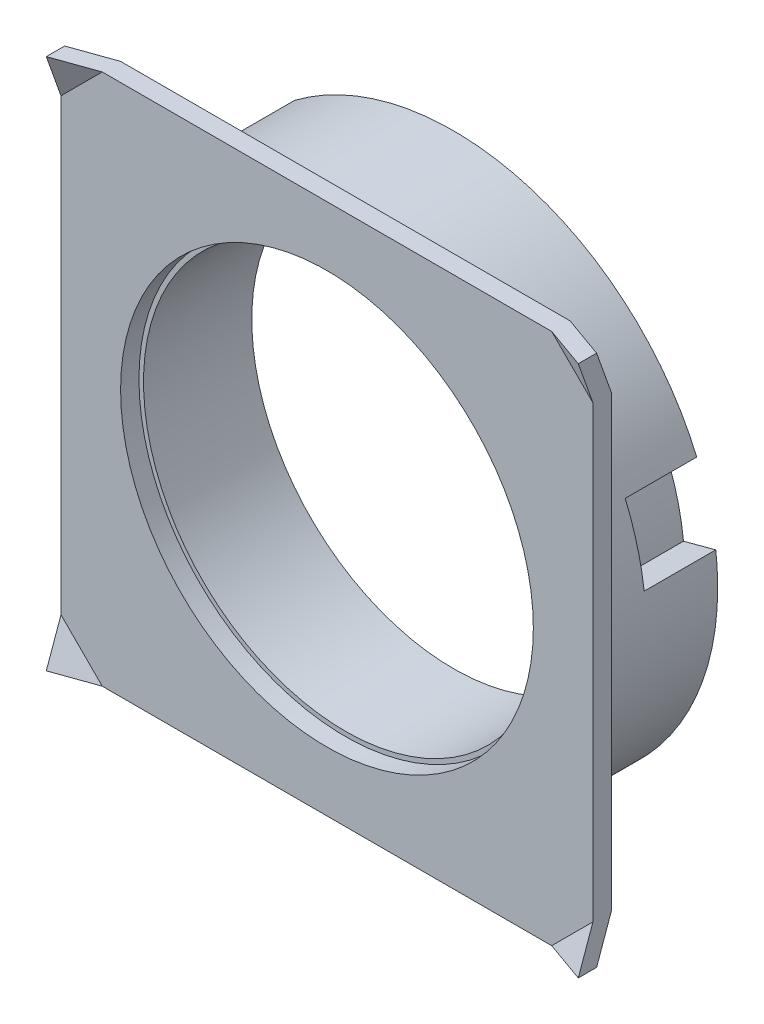
ISO-10303-21;
HEADER;
FILE_DESCRIPTION(('STEP AP214'),'2;1');
FILE_NAME('part.step','',(''),(''),'','','');
FILE_SCHEMA(('AUTOMOTIVE_DESIGN { 1 0 10303 214 1 1 1 1 }'));
ENDSEC;
DATA;
#1=APPLICATION_CONTEXT('core data for automotive mechanical design processes');
#2=APPLICATION_PROTOCOL_DEFINITION('international standard','automotive_design',2000,#1);
#3=PRODUCT_CONTEXT('',#1,'mechanical');
#4=PRODUCT('Part','Part','',(#3));
#5=PRODUCT_RELATED_PRODUCT_CATEGORY('part','',(#4));
#6=PRODUCT_DEFINITION_FORMATION('','',#4);
#7=PRODUCT_DEFINITION_CONTEXT('part definition',#1,'design');
#8=PRODUCT_DEFINITION('design','',#6,#7);
#9=PRODUCT_DEFINITION_SHAPE('','',#8);
#10=(LENGTH_UNIT() NAMED_UNIT(*) SI_UNIT(.MILLI.,.METRE.));
#11=(NAMED_UNIT(*) PLANE_ANGLE_UNIT() SI_UNIT($,.RADIAN.));
#12=(NAMED_UNIT(*) SI_UNIT($,.STERADIAN.) SOLID_ANGLE_UNIT());
#13=UNCERTAINTY_MEASURE_WITH_UNIT(LENGTH_MEASURE(1.E-05),#10,'distance_accuracy_value','');
#14=(GEOMETRIC_REPRESENTATION_CONTEXT(3) GLOBAL_UNCERTAINTY_ASSIGNED_CONTEXT((#13)) GLOBAL_UNIT_ASSIGNED_CONTEXT((#10,
#11,#12)) REPRESENTATION_CONTEXT('',''));
#15=CARTESIAN_POINT('',(0.,0.,0.));
#16=DIRECTION('',(0.,0.,1.));
#17=DIRECTION('',(1.,0.,0.));
#18=AXIS2_PLACEMENT_3D('',#15,#16,#17);
#19=CARTESIAN_POINT('',(0.,0.,-7.7));
#20=DIRECTION('',(0.,0.,1.));
#21=DIRECTION('',(1.,0.,0.));
#22=AXIS2_PLACEMENT_3D('',#19,#20,#21);
#23=CYLINDRICAL_SURFACE('',#22,14.4);
#24=DIRECTION('',(0.,0.,-1.));
#25=VECTOR('',#24,1.);
#26=CARTESIAN_POINT('',(13.2568841540254,5.62272376404435,-3.8));
#27=LINE('',#26,#25);
#28=CARTESIAN_POINT('',(13.2568841540254,5.62272376404435,-3.8));
#29=VERTEX_POINT('',#28);
#30=CARTESIAN_POINT('',(13.2568841540254,5.62272376404435,-7.7));
#31=VERTEX_POINT('',#30);
#32=EDGE_CURVE('E305',#29,#31,#27,.T.);
#33=ORIENTED_EDGE('',*,*,#32,.T.);
#34=CARTESIAN_POINT('',(0.,0.,-7.7));
#35=DIRECTION('',(0.,0.,1.));
#36=DIRECTION('',(1.,0.,0.));
#37=AXIS2_PLACEMENT_3D('',#34,#35,#36);
#38=CIRCLE('',#37,14.4);
#39=CARTESIAN_POINT('',(-8.6694365703913,11.4978636951375,-7.7));
#40=VERTEX_POINT('',#39);
#41=EDGE_CURVE('E378',#31,#40,#38,.T.);
#42=ORIENTED_EDGE('',*,*,#41,.T.);
#43=DIRECTION('',(0.,0.,-1.));
#44=VECTOR('',#43,1.);
#45=CARTESIAN_POINT('',(-8.6694365703913,11.4978636951375,-3.8));
#46=LINE('',#45,#44);
#47=CARTESIAN_POINT('',(-8.6694365703913,11.4978636951375,-3.8));
#48=VERTEX_POINT('',#47);
#49=EDGE_CURVE('E359',#48,#40,#46,.T.);
#50=ORIENTED_EDGE('',*,*,#49,.F.);
#51=CARTESIAN_POINT('',(0.,0.,-3.8));
#52=DIRECTION('',(0.,0.,-1.));
#53=DIRECTION('',(-1.,0.,0.));
#54=AXIS2_PLACEMENT_3D('',#51,#52,#53);
#55=CIRCLE('',#54,14.4);
#56=CARTESIAN_POINT('',(-11.4978636951375,8.66943657039135,-3.8));
#57=VERTEX_POINT('',#56);
#58=EDGE_CURVE('E347',#57,#48,#55,.T.);
#59=ORIENTED_EDGE('',*,*,#58,.F.);
#60=DIRECTION('',(0.,0.,-1.));
#61=VECTOR('',#60,1.);
#62=CARTESIAN_POINT('',(-11.4978636951375,8.66943657039135,-3.8));
#63=LINE('',#62,#61);
#64=CARTESIAN_POINT('',(-11.4978636951375,8.66943657039135,-7.7));
#65=VERTEX_POINT('',#64);
#66=EDGE_CURVE('E360',#57,#65,#63,.T.);
#67=ORIENTED_EDGE('',*,*,#66,.T.);
#68=CARTESIAN_POINT('',(-5.62272376404422,-13.2568841540255,-7.7));
#69=VERTEX_POINT('',#68);
#70=EDGE_CURVE('E24',#65,#69,#38,.T.);
#71=ORIENTED_EDGE('',*,*,#70,.T.);
#72=DIRECTION('',(0.,0.,-1.));
#73=VECTOR('',#72,1.);
#74=CARTESIAN_POINT('',(-5.62272376404422,-13.2568841540255,-3.8));
#75=LINE('',#74,#73);
#76=CARTESIAN_POINT('',(-5.62272376404422,-13.2568841540255,-3.8));
#77=VERTEX_POINT('',#76);
#78=EDGE_CURVE('E331',#77,#69,#75,.T.);
#79=ORIENTED_EDGE('',*,*,#78,.F.);
#80=CARTESIAN_POINT('',(0.,0.,-3.8));
#81=DIRECTION('',(0.,0.,-1.));
#82=DIRECTION('',(0.5,-0.866025403784436,0.));
#83=AXIS2_PLACEMENT_3D('',#80,#81,#82);
#84=CIRCLE('',#83,14.4);
#85=CARTESIAN_POINT('',(-1.75902045888792,-14.2921603344356,-3.8));
#86=VERTEX_POINT('',#85);
#87=EDGE_CURVE('E319',#86,#77,#84,.T.);
#88=ORIENTED_EDGE('',*,*,#87,.F.);
#89=DIRECTION('',(0.,0.,-1.));
#90=VECTOR('',#89,1.);
#91=CARTESIAN_POINT('',(-1.75902045888792,-14.2921603344356,-3.8));
#92=LINE('',#91,#90);
#93=CARTESIAN_POINT('',(-1.75902045888792,-14.2921603344356,-7.7));
#94=VERTEX_POINT('',#93);
#95=EDGE_CURVE('E332',#86,#94,#92,.T.);
#96=ORIENTED_EDGE('',*,*,#95,.T.);
#97=CARTESIAN_POINT('',(14.2921603344356,1.75902045888807,-7.7));
#98=VERTEX_POINT('',#97);
#99=EDGE_CURVE('E380',#94,#98,#38,.T.);
#100=ORIENTED_EDGE('',*,*,#99,.T.);
#101=DIRECTION('',(0.,0.,-1.));
#102=VECTOR('',#101,1.);
#103=CARTESIAN_POINT('',(14.2921603344356,1.75902045888807,-3.8));
#104=LINE('',#103,#102);
#105=CARTESIAN_POINT('',(14.2921603344356,1.75902045888807,-3.8));
#106=VERTEX_POINT('',#105);
#107=EDGE_CURVE('E304',#106,#98,#104,.T.);
#108=ORIENTED_EDGE('',*,*,#107,.F.);
#109=CARTESIAN_POINT('',(0.,0.,-3.8));
#110=DIRECTION('',(0.,0.,-1.));
#111=DIRECTION('',(0.499999999999992,0.866025403784443,0.));
#112=AXIS2_PLACEMENT_3D('',#109,#110,#111);
#113=CIRCLE('',#112,14.4);
#114=EDGE_CURVE('E292',#29,#106,#113,.T.);
#115=ORIENTED_EDGE('',*,*,#114,.F.);
#116=EDGE_LOOP('',(#33,#42,#50,#59,#67,#71,#79,#88,#96,#100,#108,#115));
#117=FACE_BOUND('',#116,.T.);
#118=CARTESIAN_POINT('',(0.,0.,-1.8));
#119=DIRECTION('',(0.,0.,1.));
#120=DIRECTION('',(1.,0.,0.));
#121=AXIS2_PLACEMENT_3D('',#118,#119,#120);
#122=CIRCLE('',#121,14.4);
#123=CARTESIAN_POINT('',(14.4,0.,-1.8));
#124=VERTEX_POINT('',#123);
#125=EDGE_CURVE('E376',#124,#124,#122,.T.);
#126=ORIENTED_EDGE('',*,*,#125,.F.);
#127=EDGE_LOOP('',(#126));
#128=FACE_BOUND('',#127,.T.);
#129=ADVANCED_FACE('F17',(#117,#128),#23,.T.);
#130=CARTESIAN_POINT('',(0.,0.,-7.7));
#131=DIRECTION('',(0.,0.,1.));
#132=DIRECTION('',(1.,0.,0.));
#133=AXIS2_PLACEMENT_3D('',#130,#131,#132);
#134=PLANE('',#133);
#135=ORIENTED_EDGE('',*,*,#41,.F.);
#136=DIRECTION('',(0.965925826289066,0.258819045102529,0.));
#137=VECTOR('',#136,1.);
#138=CARTESIAN_POINT('',(13.2568841540254,5.62272376404435,-7.7));
#139=LINE('',#138,#137);
#140=CARTESIAN_POINT('',(11.498727655928,5.15162715021158,-7.7));
#141=VERTEX_POINT('',#140);
#142=EDGE_CURVE('E290',#141,#31,#139,.T.);
#143=ORIENTED_EDGE('',*,*,#142,.F.);
#144=CARTESIAN_POINT('',(0.,0.,-7.7));
#145=DIRECTION('',(0.,0.,1.));
#146=DIRECTION('',(0.499999999999992,0.866025403784443,0.));
#147=AXIS2_PLACEMENT_3D('',#144,#145,#146);
#148=CIRCLE('',#147,12.6);
#149=CARTESIAN_POINT('',(12.5340038363381,1.28792384505531,-7.7));
#150=VERTEX_POINT('',#149);
#151=EDGE_CURVE('E287',#150,#141,#148,.T.);
#152=ORIENTED_EDGE('',*,*,#151,.F.);
#153=DIRECTION('',(-0.965925826289067,-0.258819045102526,0.));
#154=VECTOR('',#153,1.);
#155=CARTESIAN_POINT('',(14.2921603344356,1.75902045888807,-7.7));
#156=LINE('',#155,#154);
#157=EDGE_CURVE('E31',#98,#150,#156,.T.);
#158=ORIENTED_EDGE('',*,*,#157,.F.);
#159=ORIENTED_EDGE('',*,*,#99,.F.);
#160=DIRECTION('',(-0.258819045102518,-0.965925826289069,0.));
#161=VECTOR('',#160,1.);
#162=CARTESIAN_POINT('',(-1.75902045888792,-14.2921603344356,-7.7));
#163=LINE('',#162,#161);
#164=CARTESIAN_POINT('',(-1.28792384505518,-12.5340038363381,-7.7));
#165=VERTEX_POINT('',#164);
#166=EDGE_CURVE('E317',#165,#94,#163,.T.);
#167=ORIENTED_EDGE('',*,*,#166,.F.);
#168=CARTESIAN_POINT('',(0.,0.,-7.7));
#169=DIRECTION('',(0.,0.,1.));
#170=DIRECTION('',(0.5,-0.866025403784436,0.));
#171=AXIS2_PLACEMENT_3D('',#168,#169,#170);
#172=CIRCLE('',#171,12.6);
#173=CARTESIAN_POINT('',(-5.15162715021147,-11.498727655928,-7.7));
#174=VERTEX_POINT('',#173);
#175=EDGE_CURVE('E314',#174,#165,#172,.T.);
#176=ORIENTED_EDGE('',*,*,#175,.F.);
#177=DIRECTION('',(0.25881904510252,0.965925826289068,0.));
#178=VECTOR('',#177,1.);
#179=CARTESIAN_POINT('',(-5.62272376404422,-13.2568841540255,-7.7));
#180=LINE('',#179,#178);
#181=EDGE_CURVE('E39',#69,#174,#180,.T.);
#182=ORIENTED_EDGE('',*,*,#181,.F.);
#183=ORIENTED_EDGE('',*,*,#70,.F.);
#184=DIRECTION('',(-0.707106781186547,0.707106781186549,0.));
#185=VECTOR('',#184,1.);
#186=CARTESIAN_POINT('',(-11.4978636951375,8.66943657039135,-7.7));
#187=LINE('',#186,#185);
#188=CARTESIAN_POINT('',(-10.2108038108728,7.38237668612662,-7.7));
#189=VERTEX_POINT('',#188);
#190=EDGE_CURVE('E345',#189,#65,#187,.T.);
#191=ORIENTED_EDGE('',*,*,#190,.F.);
#192=CARTESIAN_POINT('',(0.,0.,-7.7));
#193=DIRECTION('',(0.,0.,1.));
#194=DIRECTION('',(-1.,0.,0.));
#195=AXIS2_PLACEMENT_3D('',#192,#193,#194);
#196=CIRCLE('',#195,12.6);
#197=CARTESIAN_POINT('',(-7.38237668612658,10.2108038108728,-7.7));
#198=VERTEX_POINT('',#197);
#199=EDGE_CURVE('E342',#198,#189,#196,.T.);
#200=ORIENTED_EDGE('',*,*,#199,.F.);
#201=DIRECTION('',(0.707106781186545,-0.70710678118655,0.));
#202=VECTOR('',#201,1.);
#203=CARTESIAN_POINT('',(-8.6694365703913,11.4978636951375,-7.7));
#204=LINE('',#203,#202);
#205=EDGE_CURVE('E335',#40,#198,#204,.T.);
#206=ORIENTED_EDGE('',*,*,#205,.F.);
#207=EDGE_LOOP('',(#135,#143,#152,#158,#159,#167,#176,#182,#183,#191,#200,#206));
#208=FACE_BOUND('',#207,.T.);
#209=CARTESIAN_POINT('',(0.,0.,-7.7));
#210=DIRECTION('',(0.,0.,1.));
#211=DIRECTION('',(1.,0.,0.));
#212=AXIS2_PLACEMENT_3D('',#209,#210,#211);
#213=CIRCLE('',#212,11.);
#214=CARTESIAN_POINT('',(11.,0.,-7.7));
#215=VERTEX_POINT('',#214);
#216=EDGE_CURVE('E373',#215,#215,#213,.T.);
#217=ORIENTED_EDGE('',*,*,#216,.T.);
#218=EDGE_LOOP('',(#217));
#219=FACE_BOUND('',#218,.T.);
#220=ADVANCED_FACE('F396',(#208,#219),#134,.F.);
#221=CARTESIAN_POINT('',(0.,0.,-1.8));
#222=DIRECTION('',(0.,0.,1.));
#223=DIRECTION('',(1.,0.,0.));
#224=AXIS2_PLACEMENT_3D('',#221,#222,#223);
#225=PLANE('',#224);
#226=CARTESIAN_POINT('',(0.,0.,-1.8));
#227=DIRECTION('',(0.,0.,1.));
#228=DIRECTION('',(1.,0.,0.));
#229=AXIS2_PLACEMENT_3D('',#226,#227,#228);
#230=CIRCLE('',#229,11.25);
#231=CARTESIAN_POINT('',(11.25,0.,-1.8));
#232=VERTEX_POINT('',#231);
#233=EDGE_CURVE('E11',#232,#232,#230,.F.);
#234=ORIENTED_EDGE('',*,*,#233,.F.);
#235=EDGE_LOOP('',(#234));
#236=FACE_BOUND('',#235,.T.);
#237=CARTESIAN_POINT('',(0.,0.,-1.8));
#238=DIRECTION('',(0.,0.,1.));
#239=DIRECTION('',(1.,0.,0.));
#240=AXIS2_PLACEMENT_3D('',#237,#238,#239);
#241=CIRCLE('',#240,11.);
#242=CARTESIAN_POINT('',(11.,0.,-1.8));
#243=VERTEX_POINT('',#242);
#244=EDGE_CURVE('E363',#243,#243,#241,.T.);
#245=ORIENTED_EDGE('',*,*,#244,.F.);
#246=EDGE_LOOP('',(#245));
#247=FACE_BOUND('',#246,.T.);
#248=ADVANCED_FACE('F443',(#236,#247),#225,.T.);
#249=CARTESIAN_POINT('',(0.,0.,-7.7));
#250=DIRECTION('',(0.,0.,1.));
#251=DIRECTION('',(1.,0.,0.));
#252=AXIS2_PLACEMENT_3D('',#249,#250,#251);
#253=CYLINDRICAL_SURFACE('',#252,11.);
#254=ORIENTED_EDGE('',*,*,#216,.F.);
#255=EDGE_LOOP('',(#254));
#256=FACE_BOUND('',#255,.T.);
#257=ORIENTED_EDGE('',*,*,#244,.T.);
#258=EDGE_LOOP('',(#257));
#259=FACE_BOUND('',#258,.T.);
#260=ADVANCED_FACE('F447',(#256,#259),#253,.F.);
#261=CARTESIAN_POINT('',(-11.4978636951375,8.66943657039135,-3.8));
#262=DIRECTION('',(-0.707106781186549,-0.707106781186547,0.));
#263=DIRECTION('',(0.707106781186547,-0.707106781186549,0.));
#264=AXIS2_PLACEMENT_3D('',#261,#262,#263);
#265=PLANE('',#264);
#266=ORIENTED_EDGE('',*,*,#190,.T.);
#267=ORIENTED_EDGE('',*,*,#66,.F.);
#268=DIRECTION('',(-0.707106781186547,0.707106781186549,0.));
#269=VECTOR('',#268,1.);
#270=CARTESIAN_POINT('',(-11.4978636951375,8.66943657039135,-3.8));
#271=LINE('',#270,#269);
#272=CARTESIAN_POINT('',(-10.2108038108728,7.38237668612662,-3.8));
#273=VERTEX_POINT('',#272);
#274=EDGE_CURVE('E356',#273,#57,#271,.T.);
#275=ORIENTED_EDGE('',*,*,#274,.F.);
#276=DIRECTION('',(0.,0.,-1.));
#277=VECTOR('',#276,1.);
#278=CARTESIAN_POINT('',(-10.2108038108728,7.38237668612662,-3.8));
#279=LINE('',#278,#277);
#280=EDGE_CURVE('E364',#273,#189,#279,.T.);
#281=ORIENTED_EDGE('',*,*,#280,.T.);
#282=EDGE_LOOP('',(#266,#267,#275,#281));
#283=FACE_BOUND('',#282,.T.);
#284=ADVANCED_FACE('F453',(#283),#265,.F.);
#285=CARTESIAN_POINT('',(0.,0.,-3.8));
#286=DIRECTION('',(0.,0.,-1.));
#287=DIRECTION('',(-1.,0.,0.));
#288=AXIS2_PLACEMENT_3D('',#285,#286,#287);
#289=CYLINDRICAL_SURFACE('',#288,12.6);
#290=ORIENTED_EDGE('',*,*,#199,.T.);
#291=ORIENTED_EDGE('',*,*,#280,.F.);
#292=CARTESIAN_POINT('',(0.,0.,-3.8));
#293=DIRECTION('',(0.,0.,1.));
#294=DIRECTION('',(-1.,0.,0.));
#295=AXIS2_PLACEMENT_3D('',#292,#293,#294);
#296=CIRCLE('',#295,12.6);
#297=CARTESIAN_POINT('',(-7.38237668612658,10.2108038108728,-3.8));
#298=VERTEX_POINT('',#297);
#299=EDGE_CURVE('E353',#298,#273,#296,.T.);
#300=ORIENTED_EDGE('',*,*,#299,.F.);
#301=DIRECTION('',(0.,0.,-1.));
#302=VECTOR('',#301,1.);
#303=CARTESIAN_POINT('',(-7.38237668612658,10.2108038108728,-3.8));
#304=LINE('',#303,#302);
#305=EDGE_CURVE('E366',#298,#198,#304,.T.);
#306=ORIENTED_EDGE('',*,*,#305,.T.);
#307=EDGE_LOOP('',(#290,#291,#300,#306));
#308=FACE_BOUND('',#307,.T.);
#309=ADVANCED_FACE('F400',(#308),#289,.T.);
#310=CARTESIAN_POINT('',(-8.6694365703913,11.4978636951375,-3.8));
#311=DIRECTION('',(0.70710678118655,0.707106781186545,0.));
#312=DIRECTION('',(-0.707106781186545,0.70710678118655,0.));
#313=AXIS2_PLACEMENT_3D('',#310,#311,#312);
#314=PLANE('',#313);
#315=ORIENTED_EDGE('',*,*,#205,.T.);
#316=ORIENTED_EDGE('',*,*,#305,.F.);
#317=DIRECTION('',(0.707106781186545,-0.70710678118655,0.));
#318=VECTOR('',#317,1.);
#319=CARTESIAN_POINT('',(-8.6694365703913,11.4978636951375,-3.8));
#320=LINE('',#319,#318);
#321=EDGE_CURVE('E350',#48,#298,#320,.T.);
#322=ORIENTED_EDGE('',*,*,#321,.F.);
#323=ORIENTED_EDGE('',*,*,#49,.T.);
#324=EDGE_LOOP('',(#315,#316,#322,#323));
#325=FACE_BOUND('',#324,.T.);
#326=ADVANCED_FACE('F394',(#325),#314,.F.);
#327=CARTESIAN_POINT('',(0.,0.,-3.8));
#328=DIRECTION('',(0.,0.,-1.));
#329=DIRECTION('',(-1.,0.,0.));
#330=AXIS2_PLACEMENT_3D('',#327,#328,#329);
#331=PLANE('',#330);
#332=ORIENTED_EDGE('',*,*,#58,.T.);
#333=ORIENTED_EDGE('',*,*,#321,.T.);
#334=ORIENTED_EDGE('',*,*,#299,.T.);
#335=ORIENTED_EDGE('',*,*,#274,.T.);
#336=EDGE_LOOP('',(#332,#333,#334,#335));
#337=FACE_BOUND('',#336,.T.);
#338=ADVANCED_FACE('F404',(#337),#331,.T.);
#339=CARTESIAN_POINT('',(-1.75902045888792,-14.2921603344356,-3.8));
#340=DIRECTION('',(0.965925826289069,-0.258819045102518,0.));
#341=DIRECTION('',(0.258819045102518,0.965925826289069,0.));
#342=AXIS2_PLACEMENT_3D('',#339,#340,#341);
#343=PLANE('',#342);
#344=ORIENTED_EDGE('',*,*,#166,.T.);
#345=ORIENTED_EDGE('',*,*,#95,.F.);
#346=DIRECTION('',(-0.258819045102518,-0.965925826289069,0.));
#347=VECTOR('',#346,1.);
#348=CARTESIAN_POINT('',(-1.75902045888792,-14.2921603344356,-3.8));
#349=LINE('',#348,#347);
#350=CARTESIAN_POINT('',(-1.28792384505518,-12.5340038363381,-3.8));
#351=VERTEX_POINT('',#350);
#352=EDGE_CURVE('E328',#351,#86,#349,.T.);
#353=ORIENTED_EDGE('',*,*,#352,.F.);
#354=DIRECTION('',(0.,0.,-1.));
#355=VECTOR('',#354,1.);
#356=CARTESIAN_POINT('',(-1.28792384505518,-12.5340038363381,-3.8));
#357=LINE('',#356,#355);
#358=EDGE_CURVE('E336',#351,#165,#357,.T.);
#359=ORIENTED_EDGE('',*,*,#358,.T.);
#360=EDGE_LOOP('',(#344,#345,#353,#359));
#361=FACE_BOUND('',#360,.T.);
#362=ADVANCED_FACE('F463',(#361),#343,.F.);
#363=CARTESIAN_POINT('',(0.,0.,-3.8));
#364=DIRECTION('',(0.,0.,-1.));
#365=DIRECTION('',(-1.,0.,0.));
#366=AXIS2_PLACEMENT_3D('',#363,#364,#365);
#367=CYLINDRICAL_SURFACE('',#366,12.6);
#368=ORIENTED_EDGE('',*,*,#175,.T.);
#369=ORIENTED_EDGE('',*,*,#358,.F.);
#370=CARTESIAN_POINT('',(0.,0.,-3.8));
#371=DIRECTION('',(0.,0.,1.));
#372=DIRECTION('',(0.5,-0.866025403784436,0.));
#373=AXIS2_PLACEMENT_3D('',#370,#371,#372);
#374=CIRCLE('',#373,12.6);
#375=CARTESIAN_POINT('',(-5.15162715021147,-11.498727655928,-3.8));
#376=VERTEX_POINT('',#375);
#377=EDGE_CURVE('E325',#376,#351,#374,.T.);
#378=ORIENTED_EDGE('',*,*,#377,.F.);
#379=DIRECTION('',(0.,0.,-1.));
#380=VECTOR('',#379,1.);
#381=CARTESIAN_POINT('',(-5.15162715021147,-11.498727655928,-3.8));
#382=LINE('',#381,#380);
#383=EDGE_CURVE('E338',#376,#174,#382,.T.);
#384=ORIENTED_EDGE('',*,*,#383,.T.);
#385=EDGE_LOOP('',(#368,#369,#378,#384));
#386=FACE_BOUND('',#385,.T.);
#387=ADVANCED_FACE('F410',(#386),#367,.T.);
#388=CARTESIAN_POINT('',(-5.62272376404422,-13.2568841540255,-3.8));
#389=DIRECTION('',(-0.965925826289069,0.25881904510252,0.));
#390=DIRECTION('',(-0.25881904510252,-0.965925826289069,0.));
#391=AXIS2_PLACEMENT_3D('',#388,#389,#390);
#392=PLANE('',#391);
#393=ORIENTED_EDGE('',*,*,#181,.T.);
#394=ORIENTED_EDGE('',*,*,#383,.F.);
#395=DIRECTION('',(0.25881904510252,0.965925826289068,0.));
#396=VECTOR('',#395,1.);
#397=CARTESIAN_POINT('',(-5.62272376404422,-13.2568841540255,-3.8));
#398=LINE('',#397,#396);
#399=EDGE_CURVE('E322',#77,#376,#398,.T.);
#400=ORIENTED_EDGE('',*,*,#399,.F.);
#401=ORIENTED_EDGE('',*,*,#78,.T.);
#402=EDGE_LOOP('',(#393,#394,#400,#401));
#403=FACE_BOUND('',#402,.T.);
#404=ADVANCED_FACE('F412',(#403),#392,.F.);
#405=CARTESIAN_POINT('',(0.,0.,-3.8));
#406=DIRECTION('',(0.,0.,-1.));
#407=DIRECTION('',(0.5,-0.866025403784436,0.));
#408=AXIS2_PLACEMENT_3D('',#405,#406,#407);
#409=PLANE('',#408);
#410=ORIENTED_EDGE('',*,*,#87,.T.);
#411=ORIENTED_EDGE('',*,*,#399,.T.);
#412=ORIENTED_EDGE('',*,*,#377,.T.);
#413=ORIENTED_EDGE('',*,*,#352,.T.);
#414=EDGE_LOOP('',(#410,#411,#412,#413));
#415=FACE_BOUND('',#414,.T.);
#416=ADVANCED_FACE('F415',(#415),#409,.T.);
#417=CARTESIAN_POINT('',(13.2568841540254,5.62272376404435,-3.8));
#418=DIRECTION('',(-0.258819045102529,0.965925826289066,0.));
#419=DIRECTION('',(-0.965925826289066,-0.258819045102529,0.));
#420=AXIS2_PLACEMENT_3D('',#417,#418,#419);
#421=PLANE('',#420);
#422=ORIENTED_EDGE('',*,*,#142,.T.);
#423=ORIENTED_EDGE('',*,*,#32,.F.);
#424=DIRECTION('',(0.965925826289066,0.258819045102529,0.));
#425=VECTOR('',#424,1.);
#426=CARTESIAN_POINT('',(13.2568841540254,5.62272376404435,-3.8));
#427=LINE('',#426,#425);
#428=CARTESIAN_POINT('',(11.498727655928,5.15162715021158,-3.8));
#429=VERTEX_POINT('',#428);
#430=EDGE_CURVE('E301',#429,#29,#427,.T.);
#431=ORIENTED_EDGE('',*,*,#430,.F.);
#432=DIRECTION('',(0.,0.,-1.));
#433=VECTOR('',#432,1.);
#434=CARTESIAN_POINT('',(11.498727655928,5.15162715021158,-3.8));
#435=LINE('',#434,#433);
#436=EDGE_CURVE('E308',#429,#141,#435,.T.);
#437=ORIENTED_EDGE('',*,*,#436,.T.);
#438=EDGE_LOOP('',(#422,#423,#431,#437));
#439=FACE_BOUND('',#438,.T.);
#440=ADVANCED_FACE('F428',(#439),#421,.F.);
#441=CARTESIAN_POINT('',(0.,0.,-3.8));
#442=DIRECTION('',(0.,0.,-1.));
#443=DIRECTION('',(-1.,0.,0.));
#444=AXIS2_PLACEMENT_3D('',#441,#442,#443);
#445=CYLINDRICAL_SURFACE('',#444,12.6);
#446=ORIENTED_EDGE('',*,*,#151,.T.);
#447=ORIENTED_EDGE('',*,*,#436,.F.);
#448=CARTESIAN_POINT('',(0.,0.,-3.8));
#449=DIRECTION('',(0.,0.,1.));
#450=DIRECTION('',(0.499999999999992,0.866025403784443,0.));
#451=AXIS2_PLACEMENT_3D('',#448,#449,#450);
#452=CIRCLE('',#451,12.6);
#453=CARTESIAN_POINT('',(12.5340038363381,1.28792384505531,-3.8));
#454=VERTEX_POINT('',#453);
#455=EDGE_CURVE('E298',#454,#429,#452,.T.);
#456=ORIENTED_EDGE('',*,*,#455,.F.);
#457=DIRECTION('',(0.,0.,-1.));
#458=VECTOR('',#457,1.);
#459=CARTESIAN_POINT('',(12.5340038363381,1.28792384505531,-3.8));
#460=LINE('',#459,#458);
#461=EDGE_CURVE('E310',#454,#150,#460,.T.);
#462=ORIENTED_EDGE('',*,*,#461,.T.);
#463=EDGE_LOOP('',(#446,#447,#456,#462));
#464=FACE_BOUND('',#463,.T.);
#465=ADVANCED_FACE('F421',(#464),#445,.T.);
#466=CARTESIAN_POINT('',(14.2921603344356,1.75902045888807,-3.8));
#467=DIRECTION('',(0.258819045102526,-0.965925826289067,0.));
#468=DIRECTION('',(0.965925826289067,0.258819045102526,0.));
#469=AXIS2_PLACEMENT_3D('',#466,#467,#468);
#470=PLANE('',#469);
#471=ORIENTED_EDGE('',*,*,#157,.T.);
#472=ORIENTED_EDGE('',*,*,#461,.F.);
#473=DIRECTION('',(-0.965925826289067,-0.258819045102526,0.));
#474=VECTOR('',#473,1.);
#475=CARTESIAN_POINT('',(14.2921603344356,1.75902045888807,-3.8));
#476=LINE('',#475,#474);
#477=EDGE_CURVE('E295',#106,#454,#476,.T.);
#478=ORIENTED_EDGE('',*,*,#477,.F.);
#479=ORIENTED_EDGE('',*,*,#107,.T.);
#480=EDGE_LOOP('',(#471,#472,#478,#479));
#481=FACE_BOUND('',#480,.T.);
#482=ADVANCED_FACE('F423',(#481),#470,.F.);
#483=CARTESIAN_POINT('',(0.,0.,-3.8));
#484=DIRECTION('',(0.,0.,-1.));
#485=DIRECTION('',(0.499999999999992,0.866025403784443,0.));
#486=AXIS2_PLACEMENT_3D('',#483,#484,#485);
#487=PLANE('',#486);
#488=ORIENTED_EDGE('',*,*,#114,.T.);
#489=ORIENTED_EDGE('',*,*,#477,.T.);
#490=ORIENTED_EDGE('',*,*,#455,.T.);
#491=ORIENTED_EDGE('',*,*,#430,.T.);
#492=EDGE_LOOP('',(#488,#489,#490,#491));
#493=FACE_BOUND('',#492,.T.);
#494=ADVANCED_FACE('F425',(#493),#487,.T.);
#495=CARTESIAN_POINT('',(26.75,0.,-1.8));
#496=DIRECTION('',(0.,0.,1.));
#497=DIRECTION('',(1.,0.,0.));
#498=AXIS2_PLACEMENT_3D('',#495,#496,#497);
#499=PLANE('',#498);
#500=ORIENTED_EDGE('',*,*,#125,.T.);
#501=EDGE_LOOP('',(#500));
#502=FACE_BOUND('',#501,.T.);
#503=DIRECTION('',(-0.707106781186548,0.707106781186548,0.));
#504=VECTOR('',#503,1.);
#505=CARTESIAN_POINT('',(12.25,14.5,-1.8));
#506=LINE('',#505,#504);
#507=CARTESIAN_POINT('',(14.5,12.25,-1.8));
#508=VERTEX_POINT('',#507);
#509=CARTESIAN_POINT('',(12.25,14.5,-1.8));
#510=VERTEX_POINT('',#509);
#511=EDGE_CURVE('E249',#508,#510,#506,.T.);
#512=ORIENTED_EDGE('',*,*,#511,.F.);
#513=DIRECTION('',(0.,1.,0.));
#514=VECTOR('',#513,1.);
#515=CARTESIAN_POINT('',(14.5,12.25,-1.8));
#516=LINE('',#515,#514);
#517=CARTESIAN_POINT('',(14.5,-12.25,-1.8));
#518=VERTEX_POINT('',#517);
#519=EDGE_CURVE('E268',#518,#508,#516,.T.);
#520=ORIENTED_EDGE('',*,*,#519,.F.);
#521=DIRECTION('',(0.707106781186548,0.707106781186548,0.));
#522=VECTOR('',#521,1.);
#523=CARTESIAN_POINT('',(12.25,-14.5,-1.8));
#524=LINE('',#523,#522);
#525=CARTESIAN_POINT('',(12.25,-14.5,-1.8));
#526=VERTEX_POINT('',#525);
#527=EDGE_CURVE('E265',#526,#518,#524,.T.);
#528=ORIENTED_EDGE('',*,*,#527,.F.);
#529=DIRECTION('',(1.,0.,0.));
#530=VECTOR('',#529,1.);
#531=CARTESIAN_POINT('',(-12.25,-14.5,-1.8));
#532=LINE('',#531,#530);
#533=CARTESIAN_POINT('',(-12.25,-14.5,-1.8));
#534=VERTEX_POINT('',#533);
#535=EDGE_CURVE('E262',#534,#526,#532,.T.);
#536=ORIENTED_EDGE('',*,*,#535,.F.);
#537=DIRECTION('',(0.707106781186548,-0.707106781186548,0.));
#538=VECTOR('',#537,1.);
#539=CARTESIAN_POINT('',(-14.5,-12.25,-1.8));
#540=LINE('',#539,#538);
#541=CARTESIAN_POINT('',(-14.5,-12.25,-1.8));
#542=VERTEX_POINT('',#541);
#543=EDGE_CURVE('E259',#542,#534,#540,.T.);
#544=ORIENTED_EDGE('',*,*,#543,.F.);
#545=DIRECTION('',(0.,-1.,0.));
#546=VECTOR('',#545,1.);
#547=CARTESIAN_POINT('',(-14.5,12.25,-1.8));
#548=LINE('',#547,#546);
#549=CARTESIAN_POINT('',(-14.5,12.25,-1.8));
#550=VERTEX_POINT('',#549);
#551=EDGE_CURVE('E257',#550,#542,#548,.T.);
#552=ORIENTED_EDGE('',*,*,#551,.F.);
#553=DIRECTION('',(-0.707106781186548,-0.707106781186548,0.));
#554=VECTOR('',#553,1.);
#555=CARTESIAN_POINT('',(-14.5,12.25,-1.8));
#556=LINE('',#555,#554);
#557=CARTESIAN_POINT('',(-12.25,14.5,-1.8));
#558=VERTEX_POINT('',#557);
#559=EDGE_CURVE('E254',#558,#550,#556,.T.);
#560=ORIENTED_EDGE('',*,*,#559,.F.);
#561=DIRECTION('',(-1.,0.,0.));
#562=VECTOR('',#561,1.);
#563=CARTESIAN_POINT('',(-12.25,14.5,-1.8));
#564=LINE('',#563,#562);
#565=EDGE_CURVE('E252',#510,#558,#564,.T.);
#566=ORIENTED_EDGE('',*,*,#565,.F.);
#567=EDGE_LOOP('',(#512,#520,#528,#536,#544,#552,#560,#566));
#568=FACE_BOUND('',#567,.T.);
#569=ADVANCED_FACE('F474',(#502,#568),#499,.F.);
#570=CARTESIAN_POINT('',(26.75,0.,-0.8));
#571=DIRECTION('',(0.,0.,1.));
#572=DIRECTION('',(1.,0.,0.));
#573=AXIS2_PLACEMENT_3D('',#570,#571,#572);
#574=PLANE('',#573);
#575=DIRECTION('',(-0.707106781186548,0.707106781186548,0.));
#576=VECTOR('',#575,1.);
#577=CARTESIAN_POINT('',(12.25,14.5,-0.8));
#578=LINE('',#577,#576);
#579=CARTESIAN_POINT('',(14.5,12.25,-0.8));
#580=VERTEX_POINT('',#579);
#581=CARTESIAN_POINT('',(12.25,14.5,-0.8));
#582=VERTEX_POINT('',#581);
#583=EDGE_CURVE('E271',#580,#582,#578,.T.);
#584=ORIENTED_EDGE('',*,*,#583,.T.);
#585=DIRECTION('',(-1.,0.,0.));
#586=VECTOR('',#585,1.);
#587=CARTESIAN_POINT('',(-12.25,14.5,-0.8));
#588=LINE('',#587,#586);
#589=CARTESIAN_POINT('',(-12.25,14.5,-0.8));
#590=VERTEX_POINT('',#589);
#591=EDGE_CURVE('E274',#582,#590,#588,.T.);
#592=ORIENTED_EDGE('',*,*,#591,.T.);
#593=DIRECTION('',(-0.707106781186548,-0.707106781186548,0.));
#594=VECTOR('',#593,1.);
#595=CARTESIAN_POINT('',(-14.5,12.25,-0.8));
#596=LINE('',#595,#594);
#597=CARTESIAN_POINT('',(-14.5,12.25,-0.8));
#598=VERTEX_POINT('',#597);
#599=EDGE_CURVE('E202',#590,#598,#596,.T.);
#600=ORIENTED_EDGE('',*,*,#599,.T.);
#601=DIRECTION('',(0.,-1.,0.));
#602=VECTOR('',#601,1.);
#603=CARTESIAN_POINT('',(-14.5,12.25,-0.8));
#604=LINE('',#603,#602);
#605=CARTESIAN_POINT('',(-14.5,-12.25,-0.8));
#606=VERTEX_POINT('',#605);
#607=EDGE_CURVE('E186',#598,#606,#604,.T.);
#608=ORIENTED_EDGE('',*,*,#607,.T.);
#609=DIRECTION('',(0.707106781186548,-0.707106781186548,0.));
#610=VECTOR('',#609,1.);
#611=CARTESIAN_POINT('',(-14.5,-12.25,-0.8));
#612=LINE('',#611,#610);
#613=CARTESIAN_POINT('',(-12.25,-14.5,-0.8));
#614=VERTEX_POINT('',#613);
#615=EDGE_CURVE('E278',#606,#614,#612,.T.);
#616=ORIENTED_EDGE('',*,*,#615,.T.);
#617=DIRECTION('',(1.,0.,0.));
#618=VECTOR('',#617,1.);
#619=CARTESIAN_POINT('',(-12.25,-14.5,-0.8));
#620=LINE('',#619,#618);
#621=CARTESIAN_POINT('',(12.25,-14.5,-0.8));
#622=VERTEX_POINT('',#621);
#623=EDGE_CURVE('E280',#614,#622,#620,.T.);
#624=ORIENTED_EDGE('',*,*,#623,.T.);
#625=DIRECTION('',(0.707106781186548,0.707106781186548,0.));
#626=VECTOR('',#625,1.);
#627=CARTESIAN_POINT('',(12.25,-14.5,-0.8));
#628=LINE('',#627,#626);
#629=CARTESIAN_POINT('',(14.5,-12.25,-0.8));
#630=VERTEX_POINT('',#629);
#631=EDGE_CURVE('E282',#622,#630,#628,.T.);
#632=ORIENTED_EDGE('',*,*,#631,.T.);
#633=DIRECTION('',(0.,1.,0.));
#634=VECTOR('',#633,1.);
#635=CARTESIAN_POINT('',(14.5,12.25,-0.8));
#636=LINE('',#635,#634);
#637=EDGE_CURVE('E284',#630,#580,#636,.T.);
#638=ORIENTED_EDGE('',*,*,#637,.T.);
#639=EDGE_LOOP('',(#584,#592,#600,#608,#616,#624,#632,#638));
#640=FACE_BOUND('',#639,.T.);
#641=CARTESIAN_POINT('',(0.,0.,-0.8));
#642=DIRECTION('',(0.,0.,1.));
#643=DIRECTION('',(1.,0.,0.));
#644=AXIS2_PLACEMENT_3D('',#641,#642,#643);
#645=CIRCLE('',#644,11.25);
#646=CARTESIAN_POINT('',(11.25,0.,-0.8));
#647=VERTEX_POINT('',#646);
#648=EDGE_CURVE('E245',#647,#647,#645,.T.);
#649=ORIENTED_EDGE('',*,*,#648,.F.);
#650=EDGE_LOOP('',(#649));
#651=FACE_BOUND('',#650,.T.);
#652=ADVANCED_FACE('F478',(#640,#651),#574,.T.);
#653=CARTESIAN_POINT('',(-12.25,14.5,-0.8));
#654=DIRECTION('',(0.,-1.,0.));
#655=DIRECTION('',(1.,0.,0.));
#656=AXIS2_PLACEMENT_3D('',#653,#654,#655);
#657=PLANE('',#656);
#658=ORIENTED_EDGE('',*,*,#565,.T.);
#659=DIRECTION('',(0.942214690279139,0.,-0.335009667654809));
#660=VECTOR('',#659,1.);
#661=CARTESIAN_POINT('',(-12.1802362794494,14.5,-1.824804878418));
#662=LINE('',#661,#660);
#663=CARTESIAN_POINT('',(-14.5,14.5,-1.));
#664=VERTEX_POINT('',#663);
#665=EDGE_CURVE('E198',#664,#558,#662,.T.);
#666=ORIENTED_EDGE('',*,*,#665,.F.);
#667=DIRECTION('',(0.,0.,1.));
#668=VECTOR('',#667,1.);
#669=CARTESIAN_POINT('',(-14.5,14.5,0.));
#670=LINE('',#669,#668);
#671=CARTESIAN_POINT('',(-14.5,14.5,0.));
#672=VERTEX_POINT('',#671);
#673=EDGE_CURVE('E183',#664,#672,#670,.T.);
#674=ORIENTED_EDGE('',*,*,#673,.T.);
#675=DIRECTION('',(-0.94221469027914,0.,0.335009667654808));
#676=VECTOR('',#675,1.);
#677=CARTESIAN_POINT('',(-10.9289758673494,14.5,-1.26969746938688));
#678=LINE('',#677,#676);
#679=EDGE_CURVE('E196',#590,#672,#678,.T.);
#680=ORIENTED_EDGE('',*,*,#679,.F.);
#681=ORIENTED_EDGE('',*,*,#591,.F.);
#682=DIRECTION('',(0.942214690279141,0.,0.335009667654805));
#683=VECTOR('',#682,1.);
#684=CARTESIAN_POINT('',(10.8828717867551,14.5,-1.28609003137597));
#685=LINE('',#684,#683);
#686=CARTESIAN_POINT('',(14.5,14.5,0.));
#687=VERTEX_POINT('',#686);
#688=EDGE_CURVE('E233',#582,#687,#685,.T.);
#689=ORIENTED_EDGE('',*,*,#688,.T.);
#690=DIRECTION('',(0.,0.,-1.));
#691=VECTOR('',#690,1.);
#692=CARTESIAN_POINT('',(14.5,14.5,0.));
#693=LINE('',#692,#691);
#694=CARTESIAN_POINT('',(14.5,14.5,-1.));
#695=VERTEX_POINT('',#694);
#696=EDGE_CURVE('E238',#687,#695,#693,.T.);
#697=ORIENTED_EDGE('',*,*,#696,.T.);
#698=DIRECTION('',(-0.94221469027914,0.,-0.335009667654806));
#699=VECTOR('',#698,1.);
#700=CARTESIAN_POINT('',(10.8828717867551,14.5,-2.28609003137597));
#701=LINE('',#700,#699);
#702=EDGE_CURVE('E235',#695,#510,#701,.T.);
#703=ORIENTED_EDGE('',*,*,#702,.T.);
#704=EDGE_LOOP('',(#658,#666,#674,#680,#681,#689,#697,#703));
#705=FACE_BOUND('',#704,.T.);
#706=ADVANCED_FACE('F195',(#705),#657,.F.);
#707=CARTESIAN_POINT('',(-14.5,12.25,-0.8));
#708=DIRECTION('',(1.,0.,0.));
#709=DIRECTION('',(0.,0.,-1.));
#710=AXIS2_PLACEMENT_3D('',#707,#708,#709);
#711=PLANE('',#710);
#712=ORIENTED_EDGE('',*,*,#551,.T.);
#713=DIRECTION('',(0.,-0.94221469027914,0.335009667654806));
#714=VECTOR('',#713,1.);
#715=CARTESIAN_POINT('',(-14.5,-10.8828717867551,-2.28609003137597));
#716=LINE('',#715,#714);
#717=CARTESIAN_POINT('',(-14.5,-14.5,-1.));
#718=VERTEX_POINT('',#717);
#719=EDGE_CURVE('E220',#542,#718,#716,.T.);
#720=ORIENTED_EDGE('',*,*,#719,.T.);
#721=DIRECTION('',(0.,0.,-1.));
#722=VECTOR('',#721,1.);
#723=CARTESIAN_POINT('',(-14.5,-14.5,0.));
#724=LINE('',#723,#722);
#725=CARTESIAN_POINT('',(-14.5,-14.5,0.));
#726=VERTEX_POINT('',#725);
#727=EDGE_CURVE('E230',#726,#718,#724,.T.);
#728=ORIENTED_EDGE('',*,*,#727,.F.);
#729=DIRECTION('',(0.,0.942214690279141,-0.335009667654805));
#730=VECTOR('',#729,1.);
#731=CARTESIAN_POINT('',(-14.5,-12.134132198855,-0.8411974404071));
#732=LINE('',#731,#730);
#733=EDGE_CURVE('E222',#726,#606,#732,.T.);
#734=ORIENTED_EDGE('',*,*,#733,.T.);
#735=ORIENTED_EDGE('',*,*,#607,.F.);
#736=DIRECTION('',(0.,0.94221469027914,0.335009667654808));
#737=VECTOR('',#736,1.);
#738=CARTESIAN_POINT('',(-14.5,10.9289758673494,-1.26969746938688));
#739=LINE('',#738,#737);
#740=EDGE_CURVE('E178',#598,#672,#739,.T.);
#741=ORIENTED_EDGE('',*,*,#740,.T.);
#742=ORIENTED_EDGE('',*,*,#673,.F.);
#743=DIRECTION('',(0.,-0.942214690279139,-0.335009667654809));
#744=VECTOR('',#743,1.);
#745=CARTESIAN_POINT('',(-14.5,12.1802362794494,-1.824804878418));
#746=LINE('',#745,#744);
#747=EDGE_CURVE('E190',#664,#550,#746,.T.);
#748=ORIENTED_EDGE('',*,*,#747,.T.);
#749=EDGE_LOOP('',(#712,#720,#728,#734,#735,#741,#742,#748));
#750=FACE_BOUND('',#749,.T.);
#751=ADVANCED_FACE('F181',(#750),#711,.F.);
#752=CARTESIAN_POINT('',(-12.25,-14.5,-0.8));
#753=DIRECTION('',(0.,1.,0.));
#754=DIRECTION('',(-1.,0.,0.));
#755=AXIS2_PLACEMENT_3D('',#752,#753,#754);
#756=PLANE('',#755);
#757=ORIENTED_EDGE('',*,*,#535,.T.);
#758=DIRECTION('',(0.94221469027914,0.,0.335009667654807));
#759=VECTOR('',#758,1.);
#760=CARTESIAN_POINT('',(12.1802362794494,-14.5,-1.824804878418));
#761=LINE('',#760,#759);
#762=CARTESIAN_POINT('',(14.5,-14.5,-1.));
#763=VERTEX_POINT('',#762);
#764=EDGE_CURVE('E199',#526,#763,#761,.T.);
#765=ORIENTED_EDGE('',*,*,#764,.T.);
#766=DIRECTION('',(0.,0.,-1.));
#767=VECTOR('',#766,1.);
#768=CARTESIAN_POINT('',(14.5,-14.5,0.));
#769=LINE('',#768,#767);
#770=CARTESIAN_POINT('',(14.5,-14.5,0.));
#771=VERTEX_POINT('',#770);
#772=EDGE_CURVE('E217',#771,#763,#769,.T.);
#773=ORIENTED_EDGE('',*,*,#772,.F.);
#774=DIRECTION('',(-0.94221469027914,0.,-0.335009667654806));
#775=VECTOR('',#774,1.);
#776=CARTESIAN_POINT('',(10.9289758673494,-14.5,-1.26969746938688));
#777=LINE('',#776,#775);
#778=EDGE_CURVE('E208',#771,#622,#777,.T.);
#779=ORIENTED_EDGE('',*,*,#778,.T.);
#780=ORIENTED_EDGE('',*,*,#623,.F.);
#781=DIRECTION('',(0.942214690279141,0.,-0.335009667654805));
#782=VECTOR('',#781,1.);
#783=CARTESIAN_POINT('',(-12.134132198855,-14.5,-0.841197440407102));
#784=LINE('',#783,#782);
#785=EDGE_CURVE('E224',#726,#614,#784,.T.);
#786=ORIENTED_EDGE('',*,*,#785,.F.);
#787=ORIENTED_EDGE('',*,*,#727,.T.);
#788=DIRECTION('',(-0.94221469027914,0.,0.335009667654806));
#789=VECTOR('',#788,1.);
#790=CARTESIAN_POINT('',(-10.8828717867551,-14.5,-2.28609003137597));
#791=LINE('',#790,#789);
#792=EDGE_CURVE('E227',#534,#718,#791,.T.);
#793=ORIENTED_EDGE('',*,*,#792,.F.);
#794=EDGE_LOOP('',(#757,#765,#773,#779,#780,#786,#787,#793));
#795=FACE_BOUND('',#794,.T.);
#796=ADVANCED_FACE('F486',(#795),#756,.F.);
#797=CARTESIAN_POINT('',(14.5,12.25,-0.8));
#798=DIRECTION('',(-1.,0.,0.));
#799=DIRECTION('',(0.,-1.,0.));
#800=AXIS2_PLACEMENT_3D('',#797,#798,#799);
#801=PLANE('',#800);
#802=ORIENTED_EDGE('',*,*,#519,.T.);
#803=DIRECTION('',(0.,-0.94221469027914,-0.335009667654806));
#804=VECTOR('',#803,1.);
#805=CARTESIAN_POINT('',(14.5,10.8828717867551,-2.28609003137597));
#806=LINE('',#805,#804);
#807=EDGE_CURVE('E239',#695,#508,#806,.T.);
#808=ORIENTED_EDGE('',*,*,#807,.F.);
#809=ORIENTED_EDGE('',*,*,#696,.F.);
#810=DIRECTION('',(0.,0.942214690279141,0.335009667654805));
#811=VECTOR('',#810,1.);
#812=CARTESIAN_POINT('',(14.5,10.8828717867551,-1.28609003137597));
#813=LINE('',#812,#811);
#814=EDGE_CURVE('E242',#580,#687,#813,.T.);
#815=ORIENTED_EDGE('',*,*,#814,.F.);
#816=ORIENTED_EDGE('',*,*,#637,.F.);
#817=DIRECTION('',(0.,0.94221469027914,-0.335009667654806));
#818=VECTOR('',#817,1.);
#819=CARTESIAN_POINT('',(14.5,-10.9289758673494,-1.26969746938688));
#820=LINE('',#819,#818);
#821=EDGE_CURVE('E214',#771,#630,#820,.T.);
#822=ORIENTED_EDGE('',*,*,#821,.F.);
#823=ORIENTED_EDGE('',*,*,#772,.T.);
#824=DIRECTION('',(0.,-0.94221469027914,0.335009667654807));
#825=VECTOR('',#824,1.);
#826=CARTESIAN_POINT('',(14.5,-12.1802362794494,-1.824804878418));
#827=LINE('',#826,#825);
#828=EDGE_CURVE('E211',#518,#763,#827,.T.);
#829=ORIENTED_EDGE('',*,*,#828,.F.);
#830=EDGE_LOOP('',(#802,#808,#809,#815,#816,#822,#823,#829));
#831=FACE_BOUND('',#830,.T.);
#832=ADVANCED_FACE('F489',(#831),#801,.F.);
#833=CARTESIAN_POINT('',(0.,0.,-0.8));
#834=DIRECTION('',(0.,0.,-1.));
#835=DIRECTION('',(-1.,0.,0.));
#836=AXIS2_PLACEMENT_3D('',#833,#834,#835);
#837=CYLINDRICAL_SURFACE('',#836,11.25);
#838=ORIENTED_EDGE('',*,*,#648,.T.);
#839=EDGE_LOOP('',(#838));
#840=FACE_BOUND('',#839,.T.);
#841=ORIENTED_EDGE('',*,*,#233,.T.);
#842=EDGE_LOOP('',(#841));
#843=FACE_BOUND('',#842,.T.);
#844=ADVANCED_FACE('F493',(#840,#843),#837,.F.);
#845=CARTESIAN_POINT('',(16.0399602244009,10.7100397755992,-1.8));
#846=DIRECTION('',(-0.317657964763751,-0.317657964763751,0.893413025898047));
#847=DIRECTION('',(0.,-0.94221469027914,-0.335009667654806));
#848=AXIS2_PLACEMENT_3D('',#845,#846,#847);
#849=PLANE('',#848);
#850=ORIENTED_EDGE('',*,*,#511,.T.);
#851=ORIENTED_EDGE('',*,*,#702,.F.);
#852=ORIENTED_EDGE('',*,*,#807,.T.);
#853=EDGE_LOOP('',(#850,#851,#852));
#854=FACE_BOUND('',#853,.T.);
#855=ADVANCED_FACE('F500',(#854),#849,.F.);
#856=CARTESIAN_POINT('',(16.0399602244009,10.7100397755992,-0.8));
#857=DIRECTION('',(0.31765796476375,0.31765796476375,-0.893413025898047));
#858=DIRECTION('',(0.,0.94221469027914,0.335009667654805));
#859=AXIS2_PLACEMENT_3D('',#856,#857,#858);
#860=PLANE('',#859);
#861=ORIENTED_EDGE('',*,*,#583,.F.);
#862=ORIENTED_EDGE('',*,*,#814,.T.);
#863=ORIENTED_EDGE('',*,*,#688,.F.);
#864=EDGE_LOOP('',(#861,#862,#863));
#865=FACE_BOUND('',#864,.T.);
#866=ADVANCED_FACE('F502',(#865),#860,.F.);
#867=CARTESIAN_POINT('',(-11.8350397755992,-17.1649602244009,0.));
#868=DIRECTION('',(-0.31765796476375,-0.31765796476375,-0.893413025898047));
#869=DIRECTION('',(0.,0.94221469027914,-0.335009667654805));
#870=AXIS2_PLACEMENT_3D('',#867,#868,#869);
#871=PLANE('',#870);
#872=ORIENTED_EDGE('',*,*,#615,.F.);
#873=ORIENTED_EDGE('',*,*,#733,.F.);
#874=ORIENTED_EDGE('',*,*,#785,.T.);
#875=EDGE_LOOP('',(#872,#873,#874));
#876=FACE_BOUND('',#875,.T.);
#877=ADVANCED_FACE('F505',(#876),#871,.F.);
#878=CARTESIAN_POINT('',(-10.7100397755992,-16.0399602244009,-1.8));
#879=DIRECTION('',(0.317657964763751,0.317657964763751,0.893413025898047));
#880=DIRECTION('',(0.,-0.94221469027914,0.335009667654806));
#881=AXIS2_PLACEMENT_3D('',#878,#879,#880);
#882=PLANE('',#881);
#883=ORIENTED_EDGE('',*,*,#543,.T.);
#884=ORIENTED_EDGE('',*,*,#792,.T.);
#885=ORIENTED_EDGE('',*,*,#719,.F.);
#886=EDGE_LOOP('',(#883,#884,#885));
#887=FACE_BOUND('',#886,.T.);
#888=ADVANCED_FACE('F510',(#887),#882,.F.);
#889=CARTESIAN_POINT('',(17.1130276773215,-11.8869723226785,-1.));
#890=DIRECTION('',(-0.317657964763752,0.317657964763752,0.893413025898046));
#891=DIRECTION('',(0.94221469027914,0.,0.335009667654807));
#892=AXIS2_PLACEMENT_3D('',#889,#890,#891);
#893=PLANE('',#892);
#894=ORIENTED_EDGE('',*,*,#527,.T.);
#895=ORIENTED_EDGE('',*,*,#828,.T.);
#896=ORIENTED_EDGE('',*,*,#764,.F.);
#897=EDGE_LOOP('',(#894,#895,#896));
#898=FACE_BOUND('',#897,.T.);
#899=ADVANCED_FACE('F513',(#898),#893,.F.);
#900=CARTESIAN_POINT('',(15.9880276773215,-10.7619723226785,-0.8));
#901=DIRECTION('',(0.317657964763751,-0.317657964763751,-0.893413025898046));
#902=DIRECTION('',(-0.94221469027914,0.,-0.335009667654806));
#903=AXIS2_PLACEMENT_3D('',#900,#901,#902);
#904=PLANE('',#903);
#905=ORIENTED_EDGE('',*,*,#631,.F.);
#906=ORIENTED_EDGE('',*,*,#778,.F.);
#907=ORIENTED_EDGE('',*,*,#821,.T.);
#908=EDGE_LOOP('',(#905,#906,#907));
#909=FACE_BOUND('',#908,.T.);
#910=ADVANCED_FACE('F518',(#909),#904,.F.);
#911=CARTESIAN_POINT('',(-10.7619723226785,15.9880276773215,-0.8));
#912=DIRECTION('',(-0.317657964763753,0.317657964763753,-0.893413025898045));
#913=DIRECTION('',(-0.94221469027914,0.,0.335009667654808));
#914=AXIS2_PLACEMENT_3D('',#911,#912,#913);
#915=PLANE('',#914);
#916=ORIENTED_EDGE('',*,*,#599,.F.);
#917=ORIENTED_EDGE('',*,*,#679,.T.);
#918=ORIENTED_EDGE('',*,*,#740,.F.);
#919=EDGE_LOOP('',(#916,#917,#918));
#920=FACE_BOUND('',#919,.T.);
#921=ADVANCED_FACE('F201',(#920),#915,.F.);
#922=CARTESIAN_POINT('',(-11.8869723226785,17.1130276773215,-1.));
#923=DIRECTION('',(0.317657964763753,-0.317657964763753,0.893413025898045));
#924=DIRECTION('',(0.942214690279139,0.,-0.335009667654809));
#925=AXIS2_PLACEMENT_3D('',#922,#923,#924);
#926=PLANE('',#925);
#927=ORIENTED_EDGE('',*,*,#559,.T.);
#928=ORIENTED_EDGE('',*,*,#747,.F.);
#929=ORIENTED_EDGE('',*,*,#665,.T.);
#930=EDGE_LOOP('',(#927,#928,#929));
#931=FACE_BOUND('',#930,.T.);
#932=ADVANCED_FACE('F525',(#931),#926,.F.);
#933=CLOSED_SHELL('',(#129,#220,#248,#260,#284,#309,#326,#338,#362,#387,#404,#416,#440,#465,
#482,#494,#569,#652,#706,#751,#796,#832,#844,#855,#866,#877,#888,#899,#910,#921,#932));
#934=MANIFOLD_SOLID_BREP('B1',#933);
#935=ADVANCED_BREP_SHAPE_REPRESENTATION('',(#18,#934),#14);
#936=SHAPE_DEFINITION_REPRESENTATION(#9,#935);
ENDSEC;
END-ISO-10303-21;
